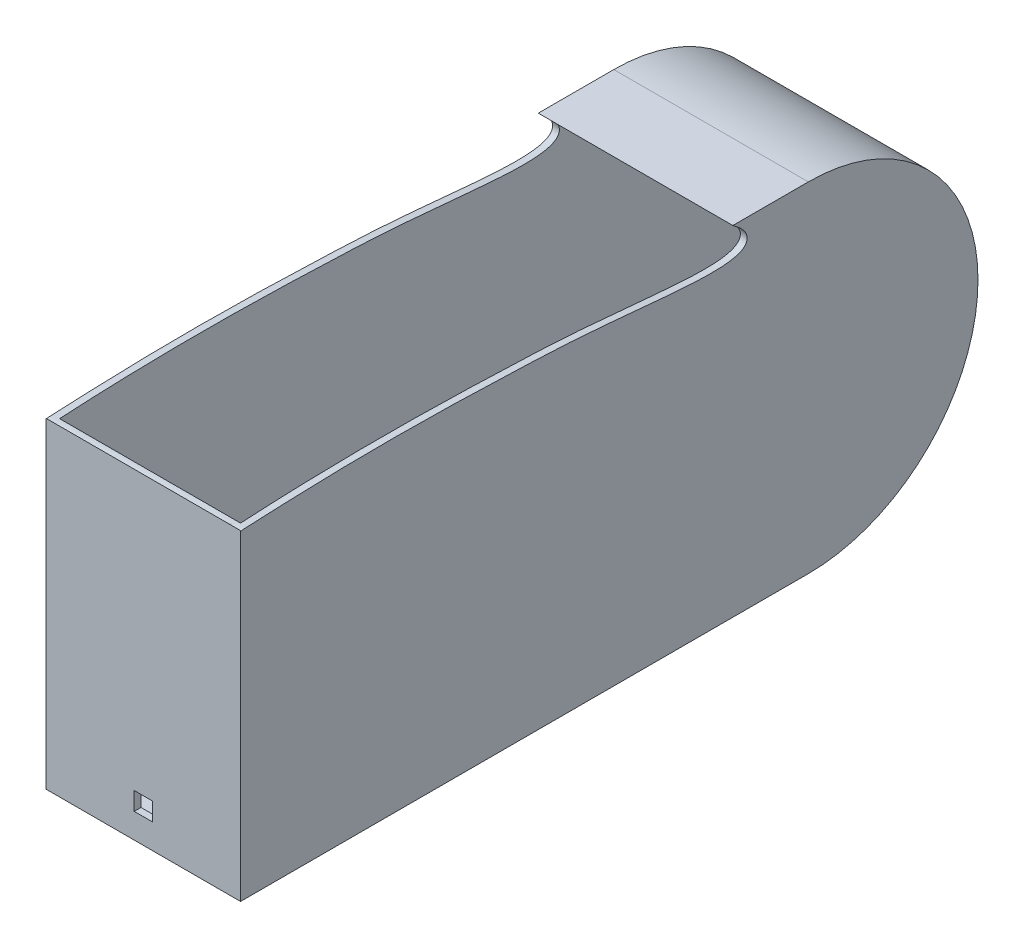
ISO-10303-21;
HEADER;
FILE_DESCRIPTION(('STEP AP214'),'2;1');
FILE_NAME('part.step','',(''),(''),'','','');
FILE_SCHEMA(('AUTOMOTIVE_DESIGN { 1 0 10303 214 1 1 1 1 }'));
ENDSEC;
DATA;
#1=APPLICATION_CONTEXT('core data for automotive mechanical design processes');
#2=APPLICATION_PROTOCOL_DEFINITION('international standard','automotive_design',2000,#1);
#3=PRODUCT_CONTEXT('',#1,'mechanical');
#4=PRODUCT('Part','Part','',(#3));
#5=PRODUCT_RELATED_PRODUCT_CATEGORY('part','',(#4));
#6=PRODUCT_DEFINITION_FORMATION('','',#4);
#7=PRODUCT_DEFINITION_CONTEXT('part definition',#1,'design');
#8=PRODUCT_DEFINITION('design','',#6,#7);
#9=PRODUCT_DEFINITION_SHAPE('','',#8);
#10=(LENGTH_UNIT() NAMED_UNIT(*) SI_UNIT(.MILLI.,.METRE.));
#11=(NAMED_UNIT(*) PLANE_ANGLE_UNIT() SI_UNIT($,.RADIAN.));
#12=(NAMED_UNIT(*) SI_UNIT($,.STERADIAN.) SOLID_ANGLE_UNIT());
#13=UNCERTAINTY_MEASURE_WITH_UNIT(LENGTH_MEASURE(1.E-05),#10,'distance_accuracy_value','');
#14=(GEOMETRIC_REPRESENTATION_CONTEXT(3) GLOBAL_UNCERTAINTY_ASSIGNED_CONTEXT((#13)) GLOBAL_UNIT_ASSIGNED_CONTEXT((#10,
#11,#12)) REPRESENTATION_CONTEXT('',''));
#15=CARTESIAN_POINT('',(0.,0.,0.));
#16=DIRECTION('',(0.,0.,1.));
#17=DIRECTION('',(1.,0.,0.));
#18=AXIS2_PLACEMENT_3D('',#15,#16,#17);
#19=CARTESIAN_POINT('',(-63.5,114.3,0.));
#20=DIRECTION('',(1.,0.,0.));
#21=DIRECTION('',(0.,0.,-1.));
#22=AXIS2_PLACEMENT_3D('',#19,#20,#21);
#23=CYLINDRICAL_SURFACE('',#22,119.0625);
#24=DIRECTION('',(1.,0.,0.));
#25=VECTOR('',#24,1.);
#26=CARTESIAN_POINT('',(-63.5,233.3625,0.));
#27=LINE('',#26,#25);
#28=CARTESIAN_POINT('',(-68.2625,233.3625,0.));
#29=VERTEX_POINT('',#28);
#30=CARTESIAN_POINT('',(68.2625,233.3625,0.));
#31=VERTEX_POINT('',#30);
#32=EDGE_CURVE('E159',#29,#31,#27,.T.);
#33=ORIENTED_EDGE('',*,*,#32,.T.);
#34=CARTESIAN_POINT('',(68.2625,114.3,0.));
#35=DIRECTION('',(1.,0.,0.));
#36=DIRECTION('',(0.,0.,-1.));
#37=AXIS2_PLACEMENT_3D('',#34,#35,#36);
#38=CIRCLE('',#37,119.0625);
#39=CARTESIAN_POINT('',(68.2625,-4.76249999999989,0.));
#40=VERTEX_POINT('',#39);
#41=EDGE_CURVE('E145',#40,#31,#38,.T.);
#42=ORIENTED_EDGE('',*,*,#41,.F.);
#43=DIRECTION('',(1.,0.,0.));
#44=VECTOR('',#43,1.);
#45=CARTESIAN_POINT('',(-63.5,-4.7625,0.));
#46=LINE('',#45,#44);
#47=CARTESIAN_POINT('',(-68.2625,-4.76249999999989,0.));
#48=VERTEX_POINT('',#47);
#49=EDGE_CURVE('E141',#48,#40,#46,.T.);
#50=ORIENTED_EDGE('',*,*,#49,.F.);
#51=CARTESIAN_POINT('',(-68.2625,114.3,0.));
#52=DIRECTION('',(1.,0.,0.));
#53=DIRECTION('',(0.,0.,-1.));
#54=AXIS2_PLACEMENT_3D('',#51,#52,#53);
#55=CIRCLE('',#54,119.0625);
#56=EDGE_CURVE('E143',#48,#29,#55,.T.);
#57=ORIENTED_EDGE('',*,*,#56,.T.);
#58=EDGE_LOOP('',(#33,#42,#50,#57));
#59=FACE_BOUND('',#58,.T.);
#60=ADVANCED_FACE('F38',(#59),#23,.T.);
#61=CARTESIAN_POINT('',(-63.5,-4.7625,0.));
#62=DIRECTION('',(0.,-1.,0.));
#63=DIRECTION('',(0.,0.,-1.));
#64=AXIS2_PLACEMENT_3D('',#61,#62,#63);
#65=PLANE('',#64);
#66=ORIENTED_EDGE('',*,*,#49,.T.);
#67=DIRECTION('',(0.,0.,-1.));
#68=VECTOR('',#67,1.);
#69=CARTESIAN_POINT('',(68.2625,-4.76249999999989,398.4625));
#70=LINE('',#69,#68);
#71=CARTESIAN_POINT('',(68.2625,-4.76249999999989,398.4625));
#72=VERTEX_POINT('',#71);
#73=EDGE_CURVE('E170',#72,#40,#70,.T.);
#74=ORIENTED_EDGE('',*,*,#73,.F.);
#75=DIRECTION('',(1.,0.,0.));
#76=VECTOR('',#75,1.);
#77=CARTESIAN_POINT('',(-63.5,-4.76250000000005,398.4625));
#78=LINE('',#77,#76);
#79=CARTESIAN_POINT('',(-68.2625,-4.76249999999989,398.4625));
#80=VERTEX_POINT('',#79);
#81=EDGE_CURVE('E164',#80,#72,#78,.T.);
#82=ORIENTED_EDGE('',*,*,#81,.F.);
#83=DIRECTION('',(0.,0.,-1.));
#84=VECTOR('',#83,1.);
#85=CARTESIAN_POINT('',(-68.2625,-4.76249999999989,398.4625));
#86=LINE('',#85,#84);
#87=EDGE_CURVE('E150',#80,#48,#86,.T.);
#88=ORIENTED_EDGE('',*,*,#87,.T.);
#89=EDGE_LOOP('',(#66,#74,#82,#88));
#90=FACE_BOUND('',#89,.T.);
#91=ADVANCED_FACE('F162',(#90),#65,.T.);
#92=CARTESIAN_POINT('',(-63.5,-4.76250000000005,398.4625));
#93=DIRECTION('',(0.,0.,1.));
#94=DIRECTION('',(1.,0.,0.));
#95=AXIS2_PLACEMENT_3D('',#92,#93,#94);
#96=PLANE('',#95);
#97=DIRECTION('',(-1.,0.,0.));
#98=VECTOR('',#97,1.);
#99=CARTESIAN_POINT('',(68.2635,220.6625,398.4625));
#100=LINE('',#99,#98);
#101=CARTESIAN_POINT('',(68.2625,220.6625,398.4625));
#102=VERTEX_POINT('',#101);
#103=CARTESIAN_POINT('',(-68.2625,220.6625,398.4625));
#104=VERTEX_POINT('',#103);
#105=EDGE_CURVE('E165',#102,#104,#100,.T.);
#106=ORIENTED_EDGE('',*,*,#105,.T.);
#107=DIRECTION('',(0.,-1.,0.));
#108=VECTOR('',#107,1.);
#109=CARTESIAN_POINT('',(-68.2625,233.3625,398.4625));
#110=LINE('',#109,#108);
#111=EDGE_CURVE('E167',#104,#80,#110,.T.);
#112=ORIENTED_EDGE('',*,*,#111,.T.);
#113=ORIENTED_EDGE('',*,*,#81,.T.);
#114=DIRECTION('',(0.,-1.,0.));
#115=VECTOR('',#114,1.);
#116=CARTESIAN_POINT('',(68.2625,233.3625,398.4625));
#117=LINE('',#116,#115);
#118=EDGE_CURVE('E194',#102,#72,#117,.T.);
#119=ORIENTED_EDGE('',*,*,#118,.F.);
#120=EDGE_LOOP('',(#106,#112,#113,#119));
#121=FACE_BOUND('',#120,.T.);
#122=DIRECTION('',(1.,0.,0.));
#123=VECTOR('',#122,1.);
#124=CARTESIAN_POINT('',(-6.35,12.7,398.4625));
#125=LINE('',#124,#123);
#126=CARTESIAN_POINT('',(-6.35,12.7,398.4625));
#127=VERTEX_POINT('',#126);
#128=CARTESIAN_POINT('',(6.35,12.7,398.4625));
#129=VERTEX_POINT('',#128);
#130=EDGE_CURVE('E241',#127,#129,#125,.T.);
#131=ORIENTED_EDGE('',*,*,#130,.F.);
#132=DIRECTION('',(0.,-1.,0.));
#133=VECTOR('',#132,1.);
#134=CARTESIAN_POINT('',(-6.35,25.4,398.4625));
#135=LINE('',#134,#133);
#136=CARTESIAN_POINT('',(-6.35,25.4,398.4625));
#137=VERTEX_POINT('',#136);
#138=EDGE_CURVE('E209',#137,#127,#135,.T.);
#139=ORIENTED_EDGE('',*,*,#138,.F.);
#140=DIRECTION('',(-1.,0.,0.));
#141=VECTOR('',#140,1.);
#142=CARTESIAN_POINT('',(-6.35,25.4,398.4625));
#143=LINE('',#142,#141);
#144=CARTESIAN_POINT('',(6.35,25.4,398.4625));
#145=VERTEX_POINT('',#144);
#146=EDGE_CURVE('E249',#145,#137,#143,.T.);
#147=ORIENTED_EDGE('',*,*,#146,.F.);
#148=DIRECTION('',(0.,1.,0.));
#149=VECTOR('',#148,1.);
#150=CARTESIAN_POINT('',(6.35,25.4,398.4625));
#151=LINE('',#150,#149);
#152=EDGE_CURVE('E245',#129,#145,#151,.T.);
#153=ORIENTED_EDGE('',*,*,#152,.F.);
#154=EDGE_LOOP('',(#131,#139,#147,#153));
#155=FACE_BOUND('',#154,.T.);
#156=ADVANCED_FACE('F273',(#121,#155),#96,.T.);
#157=CARTESIAN_POINT('',(-63.5,233.3625,398.4625));
#158=DIRECTION('',(0.,1.,0.));
#159=DIRECTION('',(0.,0.,1.));
#160=AXIS2_PLACEMENT_3D('',#157,#158,#159);
#161=PLANE('',#160);
#162=DIRECTION('',(-1.,0.,0.));
#163=VECTOR('',#162,1.);
#164=CARTESIAN_POINT('',(68.2635,233.3625,52.9941406970026));
#165=LINE('',#164,#163);
#166=CARTESIAN_POINT('',(-68.2625,233.3625,52.9941406970063));
#167=VERTEX_POINT('',#166);
#168=CARTESIAN_POINT('',(68.2625,233.3625,52.9941406970064));
#169=VERTEX_POINT('',#168);
#170=EDGE_CURVE('E82',#167,#169,#165,.F.);
#171=ORIENTED_EDGE('',*,*,#170,.T.);
#172=DIRECTION('',(0.,0.,1.));
#173=VECTOR('',#172,1.);
#174=CARTESIAN_POINT('',(68.2625,233.3625,398.4625));
#175=LINE('',#174,#173);
#176=EDGE_CURVE('E184',#31,#169,#175,.T.);
#177=ORIENTED_EDGE('',*,*,#176,.F.);
#178=ORIENTED_EDGE('',*,*,#32,.F.);
#179=DIRECTION('',(0.,0.,1.));
#180=VECTOR('',#179,1.);
#181=CARTESIAN_POINT('',(-68.2625,233.3625,398.4625));
#182=LINE('',#181,#180);
#183=EDGE_CURVE('E158',#29,#167,#182,.T.);
#184=ORIENTED_EDGE('',*,*,#183,.T.);
#185=EDGE_LOOP('',(#171,#177,#178,#184));
#186=FACE_BOUND('',#185,.T.);
#187=ADVANCED_FACE('F318',(#186),#161,.T.);
#188=CARTESIAN_POINT('',(-63.5,114.3,0.));
#189=DIRECTION('',(1.,0.,0.));
#190=DIRECTION('',(0.,0.,-1.));
#191=AXIS2_PLACEMENT_3D('',#188,#189,#190);
#192=CYLINDRICAL_SURFACE('',#191,114.3);
#193=DIRECTION('',(1.,0.,0.));
#194=VECTOR('',#193,1.);
#195=CARTESIAN_POINT('',(-63.5,0.,0.));
#196=LINE('',#195,#194);
#197=CARTESIAN_POINT('',(-63.5,0.,0.));
#198=VERTEX_POINT('',#197);
#199=CARTESIAN_POINT('',(63.5,0.,0.));
#200=VERTEX_POINT('',#199);
#201=EDGE_CURVE('E198',#198,#200,#196,.T.);
#202=ORIENTED_EDGE('',*,*,#201,.T.);
#203=CARTESIAN_POINT('',(63.5,114.3,0.));
#204=DIRECTION('',(1.,0.,0.));
#205=DIRECTION('',(0.,0.,-1.));
#206=AXIS2_PLACEMENT_3D('',#203,#204,#205);
#207=CIRCLE('',#206,114.3);
#208=CARTESIAN_POINT('',(63.5,228.6,0.));
#209=VERTEX_POINT('',#208);
#210=EDGE_CURVE('E236',#200,#209,#207,.T.);
#211=ORIENTED_EDGE('',*,*,#210,.T.);
#212=DIRECTION('',(1.,0.,0.));
#213=VECTOR('',#212,1.);
#214=CARTESIAN_POINT('',(-63.5,228.6,0.));
#215=LINE('',#214,#213);
#216=CARTESIAN_POINT('',(-63.5,228.6,0.));
#217=VERTEX_POINT('',#216);
#218=EDGE_CURVE('E191',#217,#209,#215,.T.);
#219=ORIENTED_EDGE('',*,*,#218,.F.);
#220=CARTESIAN_POINT('',(-63.5,114.3,0.));
#221=DIRECTION('',(1.,0.,0.));
#222=DIRECTION('',(0.,0.,-1.));
#223=AXIS2_PLACEMENT_3D('',#220,#221,#222);
#224=CIRCLE('',#223,114.3);
#225=EDGE_CURVE('E221',#198,#217,#224,.T.);
#226=ORIENTED_EDGE('',*,*,#225,.F.);
#227=EDGE_LOOP('',(#202,#211,#219,#226));
#228=FACE_BOUND('',#227,.T.);
#229=ADVANCED_FACE('F283',(#228),#192,.F.);
#230=CARTESIAN_POINT('',(-63.5,0.,0.));
#231=DIRECTION('',(0.,-1.,0.));
#232=DIRECTION('',(0.,0.,-1.));
#233=AXIS2_PLACEMENT_3D('',#230,#231,#232);
#234=PLANE('',#233);
#235=DIRECTION('',(1.,0.,0.));
#236=VECTOR('',#235,1.);
#237=CARTESIAN_POINT('',(-63.5,0.,393.7));
#238=LINE('',#237,#236);
#239=CARTESIAN_POINT('',(-63.5,0.,393.7));
#240=VERTEX_POINT('',#239);
#241=CARTESIAN_POINT('',(63.5,0.,393.7));
#242=VERTEX_POINT('',#241);
#243=EDGE_CURVE('E235',#240,#242,#238,.T.);
#244=ORIENTED_EDGE('',*,*,#243,.T.);
#245=DIRECTION('',(0.,0.,-1.));
#246=VECTOR('',#245,1.);
#247=CARTESIAN_POINT('',(63.5,0.,0.));
#248=LINE('',#247,#246);
#249=EDGE_CURVE('E188',#242,#200,#248,.T.);
#250=ORIENTED_EDGE('',*,*,#249,.T.);
#251=ORIENTED_EDGE('',*,*,#201,.F.);
#252=DIRECTION('',(0.,0.,-1.));
#253=VECTOR('',#252,1.);
#254=CARTESIAN_POINT('',(-63.5,0.,0.));
#255=LINE('',#254,#253);
#256=EDGE_CURVE('E179',#240,#198,#255,.T.);
#257=ORIENTED_EDGE('',*,*,#256,.F.);
#258=EDGE_LOOP('',(#244,#250,#251,#257));
#259=FACE_BOUND('',#258,.T.);
#260=ADVANCED_FACE('F287',(#259),#234,.F.);
#261=CARTESIAN_POINT('',(-63.5,0.,393.7));
#262=DIRECTION('',(0.,0.,1.));
#263=DIRECTION('',(1.,0.,0.));
#264=AXIS2_PLACEMENT_3D('',#261,#262,#263);
#265=PLANE('',#264);
#266=DIRECTION('',(0.,1.,0.));
#267=VECTOR('',#266,1.);
#268=CARTESIAN_POINT('',(-6.35,25.4,393.7));
#269=LINE('',#268,#267);
#270=CARTESIAN_POINT('',(-6.35,12.7,393.7));
#271=VERTEX_POINT('',#270);
#272=CARTESIAN_POINT('',(-6.35,25.4,393.7));
#273=VERTEX_POINT('',#272);
#274=EDGE_CURVE('E254',#271,#273,#269,.T.);
#275=ORIENTED_EDGE('',*,*,#274,.F.);
#276=DIRECTION('',(-1.,0.,0.));
#277=VECTOR('',#276,1.);
#278=CARTESIAN_POINT('',(-6.35,12.7,393.7));
#279=LINE('',#278,#277);
#280=CARTESIAN_POINT('',(6.35,12.7,393.7));
#281=VERTEX_POINT('',#280);
#282=EDGE_CURVE('E242',#281,#271,#279,.T.);
#283=ORIENTED_EDGE('',*,*,#282,.F.);
#284=DIRECTION('',(0.,-1.,0.));
#285=VECTOR('',#284,1.);
#286=CARTESIAN_POINT('',(6.35,25.4,393.7));
#287=LINE('',#286,#285);
#288=CARTESIAN_POINT('',(6.35,25.4,393.7));
#289=VERTEX_POINT('',#288);
#290=EDGE_CURVE('E246',#289,#281,#287,.T.);
#291=ORIENTED_EDGE('',*,*,#290,.F.);
#292=DIRECTION('',(1.,0.,0.));
#293=VECTOR('',#292,1.);
#294=CARTESIAN_POINT('',(-6.35,25.4,393.7));
#295=LINE('',#294,#293);
#296=EDGE_CURVE('E250',#273,#289,#295,.T.);
#297=ORIENTED_EDGE('',*,*,#296,.F.);
#298=EDGE_LOOP('',(#275,#283,#291,#297));
#299=FACE_BOUND('',#298,.T.);
#300=DIRECTION('',(0.,-1.,0.));
#301=VECTOR('',#300,1.);
#302=CARTESIAN_POINT('',(-63.5,0.,393.7));
#303=LINE('',#302,#301);
#304=CARTESIAN_POINT('',(-63.5,220.431417677347,393.7));
#305=VERTEX_POINT('',#304);
#306=EDGE_CURVE('E177',#305,#240,#303,.T.);
#307=ORIENTED_EDGE('',*,*,#306,.F.);
#308=DIRECTION('',(-1.,0.,0.));
#309=VECTOR('',#308,1.);
#310=CARTESIAN_POINT('',(68.2635,220.431417677364,393.7));
#311=LINE('',#310,#309);
#312=CARTESIAN_POINT('',(63.5,220.431417677347,393.700000003167));
#313=VERTEX_POINT('',#312);
#314=EDGE_CURVE('E174',#313,#305,#311,.T.);
#315=ORIENTED_EDGE('',*,*,#314,.F.);
#316=DIRECTION('',(0.,-1.,0.));
#317=VECTOR('',#316,1.);
#318=CARTESIAN_POINT('',(63.5,0.,393.7));
#319=LINE('',#318,#317);
#320=EDGE_CURVE('E185',#313,#242,#319,.T.);
#321=ORIENTED_EDGE('',*,*,#320,.T.);
#322=ORIENTED_EDGE('',*,*,#243,.F.);
#323=EDGE_LOOP('',(#307,#315,#321,#322));
#324=FACE_BOUND('',#323,.T.);
#325=ADVANCED_FACE('F40',(#299,#324),#265,.F.);
#326=CARTESIAN_POINT('',(-63.5,228.6,393.7));
#327=DIRECTION('',(0.,1.,0.));
#328=DIRECTION('',(0.,0.,1.));
#329=AXIS2_PLACEMENT_3D('',#326,#327,#328);
#330=PLANE('',#329);
#331=DIRECTION('',(0.,0.,1.));
#332=VECTOR('',#331,1.);
#333=CARTESIAN_POINT('',(63.5,228.6,393.7));
#334=LINE('',#333,#332);
#335=CARTESIAN_POINT('',(63.5,228.600000000172,47.2494261996637));
#336=VERTEX_POINT('',#335);
#337=EDGE_CURVE('E187',#209,#336,#334,.T.);
#338=ORIENTED_EDGE('',*,*,#337,.T.);
#339=DIRECTION('',(-1.,0.,0.));
#340=VECTOR('',#339,1.);
#341=CARTESIAN_POINT('',(68.2635,228.6,47.2494261994933));
#342=LINE('',#341,#340);
#343=CARTESIAN_POINT('',(-63.5,228.6,47.2494261996637));
#344=VERTEX_POINT('',#343);
#345=EDGE_CURVE('E50',#344,#336,#342,.F.);
#346=ORIENTED_EDGE('',*,*,#345,.F.);
#347=DIRECTION('',(0.,0.,1.));
#348=VECTOR('',#347,1.);
#349=CARTESIAN_POINT('',(-63.5,228.6,393.7));
#350=LINE('',#349,#348);
#351=EDGE_CURVE('E181',#217,#344,#350,.T.);
#352=ORIENTED_EDGE('',*,*,#351,.F.);
#353=ORIENTED_EDGE('',*,*,#218,.T.);
#354=EDGE_LOOP('',(#338,#346,#352,#353));
#355=FACE_BOUND('',#354,.T.);
#356=ADVANCED_FACE('F295',(#355),#330,.F.);
#357=CARTESIAN_POINT('',(-6.35,12.7,-119.0635));
#358=DIRECTION('',(0.,-1.,0.));
#359=DIRECTION('',(0.,0.,-1.));
#360=AXIS2_PLACEMENT_3D('',#357,#358,#359);
#361=PLANE('',#360);
#362=ORIENTED_EDGE('',*,*,#282,.T.);
#363=DIRECTION('',(0.,0.,1.));
#364=VECTOR('',#363,1.);
#365=CARTESIAN_POINT('',(-6.35,12.7,-119.0635));
#366=LINE('',#365,#364);
#367=EDGE_CURVE('E239',#271,#127,#366,.T.);
#368=ORIENTED_EDGE('',*,*,#367,.T.);
#369=ORIENTED_EDGE('',*,*,#130,.T.);
#370=DIRECTION('',(0.,0.,1.));
#371=VECTOR('',#370,1.);
#372=CARTESIAN_POINT('',(6.35,12.7,-119.0635));
#373=LINE('',#372,#371);
#374=EDGE_CURVE('E243',#281,#129,#373,.T.);
#375=ORIENTED_EDGE('',*,*,#374,.F.);
#376=EDGE_LOOP('',(#362,#368,#369,#375));
#377=FACE_BOUND('',#376,.T.);
#378=ADVANCED_FACE('F307',(#377),#361,.F.);
#379=CARTESIAN_POINT('',(6.35,25.4,-119.0635));
#380=DIRECTION('',(1.,0.,0.));
#381=DIRECTION('',(0.,1.,0.));
#382=AXIS2_PLACEMENT_3D('',#379,#380,#381);
#383=PLANE('',#382);
#384=ORIENTED_EDGE('',*,*,#290,.T.);
#385=ORIENTED_EDGE('',*,*,#374,.T.);
#386=ORIENTED_EDGE('',*,*,#152,.T.);
#387=DIRECTION('',(0.,0.,1.));
#388=VECTOR('',#387,1.);
#389=CARTESIAN_POINT('',(6.35,25.4,-119.0635));
#390=LINE('',#389,#388);
#391=EDGE_CURVE('E247',#289,#145,#390,.T.);
#392=ORIENTED_EDGE('',*,*,#391,.F.);
#393=EDGE_LOOP('',(#384,#385,#386,#392));
#394=FACE_BOUND('',#393,.T.);
#395=ADVANCED_FACE('F322',(#394),#383,.F.);
#396=CARTESIAN_POINT('',(-6.35,25.4,-119.0635));
#397=DIRECTION('',(0.,1.,0.));
#398=DIRECTION('',(0.,0.,1.));
#399=AXIS2_PLACEMENT_3D('',#396,#397,#398);
#400=PLANE('',#399);
#401=ORIENTED_EDGE('',*,*,#296,.T.);
#402=ORIENTED_EDGE('',*,*,#391,.T.);
#403=ORIENTED_EDGE('',*,*,#146,.T.);
#404=DIRECTION('',(0.,0.,1.));
#405=VECTOR('',#404,1.);
#406=CARTESIAN_POINT('',(-6.35,25.4,-119.0635));
#407=LINE('',#406,#405);
#408=EDGE_CURVE('E251',#273,#137,#407,.T.);
#409=ORIENTED_EDGE('',*,*,#408,.F.);
#410=EDGE_LOOP('',(#401,#402,#403,#409));
#411=FACE_BOUND('',#410,.T.);
#412=ADVANCED_FACE('F326',(#411),#400,.F.);
#413=CARTESIAN_POINT('',(-6.35,25.4,-119.0635));
#414=DIRECTION('',(-1.,0.,0.));
#415=DIRECTION('',(0.,-1.,0.));
#416=AXIS2_PLACEMENT_3D('',#413,#414,#415);
#417=PLANE('',#416);
#418=ORIENTED_EDGE('',*,*,#274,.T.);
#419=ORIENTED_EDGE('',*,*,#408,.T.);
#420=ORIENTED_EDGE('',*,*,#138,.T.);
#421=ORIENTED_EDGE('',*,*,#367,.F.);
#422=EDGE_LOOP('',(#418,#419,#420,#421));
#423=FACE_BOUND('',#422,.T.);
#424=ADVANCED_FACE('F330',(#423),#417,.F.);
#425=CARTESIAN_POINT('',(63.5,114.3,0.));
#426=DIRECTION('',(1.,0.,0.));
#427=DIRECTION('',(0.,0.,-1.));
#428=AXIS2_PLACEMENT_3D('',#425,#426,#427);
#429=PLANE('',#428);
#430=ORIENTED_EDGE('',*,*,#320,.F.);
#431=CARTESIAN_POINT('',(63.5,221.103452286152,398.549393222915));
#432=CARTESIAN_POINT('',(63.5,221.211009465947,398.232700594571));
#433=CARTESIAN_POINT('',(63.5,221.639549780142,396.970901440742));
#434=CARTESIAN_POINT('',(63.5,222.600485882355,394.146421090202));
#435=CARTESIAN_POINT('',(63.5,224.150302438679,389.462953516682));
#436=CARTESIAN_POINT('',(63.5,226.259749177724,382.969998463607));
#437=CARTESIAN_POINT('',(63.5,228.841368447249,374.723245355379));
#438=CARTESIAN_POINT('',(63.5,231.81387248124,364.800004809874));
#439=CARTESIAN_POINT('',(63.5,235.083165456711,353.29797869617));
#440=CARTESIAN_POINT('',(63.5,238.545255757918,340.328032508214));
#441=CARTESIAN_POINT('',(63.5,242.094575025628,326.021148985206));
#442=CARTESIAN_POINT('',(63.5,245.617549826205,310.521429797442));
#443=CARTESIAN_POINT('',(63.5,249.024771645133,293.99492793284));
#444=CARTESIAN_POINT('',(63.5,252.204320359588,276.614504443241));
#445=CARTESIAN_POINT('',(63.5,255.061254060712,258.567862768213));
#446=CARTESIAN_POINT('',(63.5,257.520201331038,240.053343741062));
#447=CARTESIAN_POINT('',(63.5,259.500514547056,221.279209388613));
#448=CARTESIAN_POINT('',(63.5,260.937616248262,202.447059387589));
#449=CARTESIAN_POINT('',(63.5,261.853164617752,183.641819280323));
#450=CARTESIAN_POINT('',(63.5,261.889242871964,165.066079575411));
#451=CARTESIAN_POINT('',(63.5,260.902418125429,146.980070346122));
#452=CARTESIAN_POINT('',(63.5,258.9850339095,129.758757052741));
#453=CARTESIAN_POINT('',(63.5,256.246806811277,113.629585220945));
#454=CARTESIAN_POINT('',(63.5,252.805079968523,98.8044568058425));
#455=CARTESIAN_POINT('',(63.5,248.825528286306,85.4686561606705));
#456=CARTESIAN_POINT('',(63.5,244.484590441484,73.7774953433273));
#457=CARTESIAN_POINT('',(63.5,239.956374948211,63.8562172520555));
#458=CARTESIAN_POINT('',(63.5,235.414103693613,55.7982016235295));
#459=CARTESIAN_POINT('',(63.5,231.01719821287,49.6386087890458));
#460=CARTESIAN_POINT('',(63.5,226.860803831245,45.4101405287787));
#461=CARTESIAN_POINT('',(63.5,222.931348779444,42.9828663673022));
#462=CARTESIAN_POINT('',(63.5,218.986296857464,42.778551080553));
#463=CARTESIAN_POINT('',(63.5,215.836723638551,45.1303745015469));
#464=CARTESIAN_POINT('',(63.5,213.876038864295,49.2376949401899));
#465=CARTESIAN_POINT('',(63.5,212.601675942051,54.8784894371254));
#466=CARTESIAN_POINT('',(63.5,211.952589942483,62.1414319366596));
#467=CARTESIAN_POINT('',(63.5,211.854882503057,70.9544974326083));
#468=CARTESIAN_POINT('',(63.5,212.250908039219,81.233579012899));
#469=CARTESIAN_POINT('',(63.5,213.053608959908,92.8633516606358));
#470=CARTESIAN_POINT('',(63.5,214.173533720422,105.724740235377));
#471=CARTESIAN_POINT('',(63.5,215.488554616551,119.693166749208));
#472=CARTESIAN_POINT('',(63.5,216.890924890213,134.64317648004));
#473=CARTESIAN_POINT('',(63.5,218.264163949801,150.44570999627));
#474=CARTESIAN_POINT('',(63.5,219.486485378968,166.970044113907));
#475=CARTESIAN_POINT('',(63.5,220.428545699325,184.211284991632));
#476=CARTESIAN_POINT('',(63.5,221.118607839099,202.015771526671));
#477=CARTESIAN_POINT('',(63.5,221.829251020905,220.195805294187));
#478=CARTESIAN_POINT('',(63.5,222.413221362861,238.435682057207));
#479=CARTESIAN_POINT('',(63.5,222.857510837363,256.531925378719));
#480=CARTESIAN_POINT('',(63.5,223.140033413405,274.291608724487));
#481=CARTESIAN_POINT('',(63.5,223.252027693137,291.519175726337));
#482=CARTESIAN_POINT('',(63.5,223.203320199009,308.022545068698));
#483=CARTESIAN_POINT('',(63.5,223.020606611835,323.615565220504));
#484=CARTESIAN_POINT('',(63.5,222.71075189044,338.118364345008));
#485=CARTESIAN_POINT('',(63.5,222.338100855146,351.360747498457));
#486=CARTESIAN_POINT('',(63.5,221.908988988218,363.191371257319));
#487=CARTESIAN_POINT('',(63.5,221.495841486537,373.444754132704));
#488=CARTESIAN_POINT('',(63.5,221.047668799869,382.066215664096));
#489=CARTESIAN_POINT('',(63.5,220.841691742326,388.75364095758));
#490=CARTESIAN_POINT('',(63.5,220.266487962213,393.905599592566));
#491=CARTESIAN_POINT('',(63.5,220.648579963455,396.455855293674));
#492=CARTESIAN_POINT('',(63.5,219.934638372019,398.42299084249));
#493=CARTESIAN_POINT('',(63.5,220.490245124887,398.453149809345));
#494=CARTESIAN_POINT('',(63.5,220.6625,398.4625));
#495=B_SPLINE_CURVE_WITH_KNOTS('',3,(#431,#432,#433,#434,#435,#436,#437,#438,#439,#440,#441,
#442,#443,#444,#445,#446,#447,#448,#449,#450,#451,#452,#453,#454,#455,#456,#457,#458,#459,#460,
#461,#462,#463,#464,#465,#466,#467,#468,#469,#470,#471,#472,#473,#474,#475,#476,#477,#478,#479,
#480,#481,#482,#483,#484,#485,#486,#487,#488,#489,#490,#491,#492,#493,#494),.UNSPECIFIED.,.F.,
.F.,(4,1,1,1,1,1,1,1,1,1,1,1,1,1,1,1,1,1,1,1,1,1,1,1,1,1,1,1,1,1,1,1,1,1,1,1,1,1,1,1,1,1,1,1,1,
1,1,1,1,1,1,1,1,1,1,1,1,1,1,1,1,4),(0.,0.0013715766250261,0.00546477584250823,
0.0122348018502247,0.0216019692657692,0.0334613445682541,0.0476712497544171,0.0640813180473265,
0.082496261138008,0.102719148689264,0.124527079157664,0.14767564836169,0.171912572572513,
0.196978379588112,0.222596912267761,0.248496766675201,0.274385100810321,0.300041178316028,
0.325689987882079,0.350525087532111,0.374279703233646,0.39671125377608,0.41757673414408,
0.436654005915541,0.45374438973928,0.468679993939526,0.481329415272233,0.491630702034347,
0.499615788540128,0.50554628117804,0.510184984462959,0.514824193684277,0.520701508332397,
0.528516039729706,0.538465751713385,0.55054260931231,0.564643256443601,0.580638139182816,
0.598344876375769,0.617584458372554,0.638174400803704,0.659922089978603,0.682632113153432,
0.706120665440723,0.730727382957721,0.755700243562022,0.780731768779878,0.805564462972336,
0.829932395841959,0.853570292180875,0.876213105152017,0.897609986535304,0.917519393525195,
0.93569834721614,0.951942678095032,0.966047158851578,0.977839939974046,0.987174001699795,
0.993931500880097,0.998018399437236,0.999385643972647,1.),.UNSPECIFIED.);
#496=EDGE_CURVE('E11',#336,#313,#495,.T.);
#497=ORIENTED_EDGE('',*,*,#496,.F.);
#498=ORIENTED_EDGE('',*,*,#337,.F.);
#499=ORIENTED_EDGE('',*,*,#210,.F.);
#500=ORIENTED_EDGE('',*,*,#249,.F.);
#501=EDGE_LOOP('',(#430,#497,#498,#499,#500));
#502=FACE_BOUND('',#501,.T.);
#503=ADVANCED_FACE('F291',(#502),#429,.F.);
#504=CARTESIAN_POINT('',(68.2625,114.3,0.));
#505=DIRECTION('',(1.,0.,0.));
#506=DIRECTION('',(0.,0.,-1.));
#507=AXIS2_PLACEMENT_3D('',#504,#505,#506);
#508=PLANE('',#507);
#509=CARTESIAN_POINT('',(68.2625,221.103452286152,398.549393222915));
#510=CARTESIAN_POINT('',(68.2625,221.211009465947,398.232700594571));
#511=CARTESIAN_POINT('',(68.2625,221.639549780142,396.970901440742));
#512=CARTESIAN_POINT('',(68.2625,222.600485882355,394.146421090202));
#513=CARTESIAN_POINT('',(68.2625,224.150302438679,389.462953516682));
#514=CARTESIAN_POINT('',(68.2625,226.259749177724,382.969998463607));
#515=CARTESIAN_POINT('',(68.2625,228.841368447249,374.723245355379));
#516=CARTESIAN_POINT('',(68.2625,231.81387248124,364.800004809874));
#517=CARTESIAN_POINT('',(68.2625,235.083165456711,353.29797869617));
#518=CARTESIAN_POINT('',(68.2625,238.545255757918,340.328032508214));
#519=CARTESIAN_POINT('',(68.2625,242.094575025628,326.021148985206));
#520=CARTESIAN_POINT('',(68.2625,245.617549826205,310.521429797442));
#521=CARTESIAN_POINT('',(68.2625,249.024771645133,293.99492793284));
#522=CARTESIAN_POINT('',(68.2625,252.204320359588,276.614504443241));
#523=CARTESIAN_POINT('',(68.2625,255.061254060712,258.567862768213));
#524=CARTESIAN_POINT('',(68.2625,257.520201331038,240.053343741062));
#525=CARTESIAN_POINT('',(68.2625,259.500514547056,221.279209388613));
#526=CARTESIAN_POINT('',(68.2625,260.937616248262,202.447059387589));
#527=CARTESIAN_POINT('',(68.2625,261.853164617752,183.641819280323));
#528=CARTESIAN_POINT('',(68.2625,261.889242871964,165.066079575411));
#529=CARTESIAN_POINT('',(68.2625,260.902418125429,146.980070346122));
#530=CARTESIAN_POINT('',(68.2625,258.9850339095,129.758757052741));
#531=CARTESIAN_POINT('',(68.2625,256.246806811277,113.629585220945));
#532=CARTESIAN_POINT('',(68.2625,252.805079968523,98.8044568058425));
#533=CARTESIAN_POINT('',(68.2625,248.825528286306,85.4686561606705));
#534=CARTESIAN_POINT('',(68.2625,244.484590441484,73.7774953433273));
#535=CARTESIAN_POINT('',(68.2625,239.956374948211,63.8562172520555));
#536=CARTESIAN_POINT('',(68.2625,235.414103693613,55.7982016235295));
#537=CARTESIAN_POINT('',(68.2625,231.01719821287,49.6386087890458));
#538=CARTESIAN_POINT('',(68.2625,226.860803831245,45.4101405287787));
#539=CARTESIAN_POINT('',(68.2625,222.931348779444,42.9828663673022));
#540=CARTESIAN_POINT('',(68.2625,218.986296857464,42.778551080553));
#541=CARTESIAN_POINT('',(68.2625,215.836723638551,45.1303745015469));
#542=CARTESIAN_POINT('',(68.2625,213.876038864295,49.2376949401899));
#543=CARTESIAN_POINT('',(68.2625,212.601675942051,54.8784894371254));
#544=CARTESIAN_POINT('',(68.2625,211.952589942483,62.1414319366596));
#545=CARTESIAN_POINT('',(68.2625,211.854882503057,70.9544974326083));
#546=CARTESIAN_POINT('',(68.2625,212.250908039219,81.233579012899));
#547=CARTESIAN_POINT('',(68.2625,213.053608959908,92.8633516606358));
#548=CARTESIAN_POINT('',(68.2625,214.173533720422,105.724740235377));
#549=CARTESIAN_POINT('',(68.2625,215.488554616551,119.693166749208));
#550=CARTESIAN_POINT('',(68.2625,216.890924890213,134.64317648004));
#551=CARTESIAN_POINT('',(68.2625,218.264163949801,150.44570999627));
#552=CARTESIAN_POINT('',(68.2625,219.486485378968,166.970044113907));
#553=CARTESIAN_POINT('',(68.2625,220.428545699325,184.211284991632));
#554=CARTESIAN_POINT('',(68.2625,221.118607839099,202.015771526671));
#555=CARTESIAN_POINT('',(68.2625,221.829251020905,220.195805294187));
#556=CARTESIAN_POINT('',(68.2625,222.413221362861,238.435682057207));
#557=CARTESIAN_POINT('',(68.2625,222.857510837363,256.531925378719));
#558=CARTESIAN_POINT('',(68.2625,223.140033413405,274.291608724487));
#559=CARTESIAN_POINT('',(68.2625,223.252027693137,291.519175726337));
#560=CARTESIAN_POINT('',(68.2625,223.203320199009,308.022545068698));
#561=CARTESIAN_POINT('',(68.2625,223.020606611835,323.615565220504));
#562=CARTESIAN_POINT('',(68.2625,222.71075189044,338.118364345008));
#563=CARTESIAN_POINT('',(68.2625,222.338100855146,351.360747498457));
#564=CARTESIAN_POINT('',(68.2625,221.908988988218,363.191371257319));
#565=CARTESIAN_POINT('',(68.2625,221.495841486537,373.444754132704));
#566=CARTESIAN_POINT('',(68.2625,221.047668799869,382.066215664096));
#567=CARTESIAN_POINT('',(68.2625,220.841691742326,388.75364095758));
#568=CARTESIAN_POINT('',(68.2625,220.266487962213,393.905599592566));
#569=CARTESIAN_POINT('',(68.2625,220.648579963455,396.455855293674));
#570=CARTESIAN_POINT('',(68.2625,219.934638372019,398.42299084249));
#571=CARTESIAN_POINT('',(68.2625,220.490245124887,398.453149809345));
#572=CARTESIAN_POINT('',(68.2625,220.6625,398.4625));
#573=B_SPLINE_CURVE_WITH_KNOTS('',3,(#509,#510,#511,#512,#513,#514,#515,#516,#517,#518,#519,
#520,#521,#522,#523,#524,#525,#526,#527,#528,#529,#530,#531,#532,#533,#534,#535,#536,#537,#538,
#539,#540,#541,#542,#543,#544,#545,#546,#547,#548,#549,#550,#551,#552,#553,#554,#555,#556,#557,
#558,#559,#560,#561,#562,#563,#564,#565,#566,#567,#568,#569,#570,#571,#572),.UNSPECIFIED.,.F.,
.F.,(4,1,1,1,1,1,1,1,1,1,1,1,1,1,1,1,1,1,1,1,1,1,1,1,1,1,1,1,1,1,1,1,1,1,1,1,1,1,1,1,1,1,1,1,1,
1,1,1,1,1,1,1,1,1,1,1,1,1,1,1,1,4),(0.,0.0013715766250261,0.00546477584250823,
0.0122348018502247,0.0216019692657692,0.0334613445682541,0.0476712497544171,0.0640813180473265,
0.082496261138008,0.102719148689264,0.124527079157664,0.14767564836169,0.171912572572513,
0.196978379588112,0.222596912267761,0.248496766675201,0.274385100810321,0.300041178316028,
0.325689987882079,0.350525087532111,0.374279703233646,0.39671125377608,0.41757673414408,
0.436654005915541,0.45374438973928,0.468679993939526,0.481329415272233,0.491630702034347,
0.499615788540128,0.50554628117804,0.510184984462959,0.514824193684277,0.520701508332397,
0.528516039729706,0.538465751713385,0.55054260931231,0.564643256443601,0.580638139182816,
0.598344876375769,0.617584458372554,0.638174400803704,0.659922089978603,0.682632113153432,
0.706120665440723,0.730727382957721,0.755700243562022,0.780731768779878,0.805564462972336,
0.829932395841959,0.853570292180875,0.876213105152017,0.897609986535304,0.917519393525195,
0.93569834721614,0.951942678095032,0.966047158851578,0.977839939974046,0.987174001699795,
0.993931500880097,0.998018399437236,0.999385643972647,1.),.UNSPECIFIED.);
#574=EDGE_CURVE('E196',#169,#102,#573,.T.);
#575=ORIENTED_EDGE('',*,*,#574,.T.);
#576=ORIENTED_EDGE('',*,*,#118,.T.);
#577=ORIENTED_EDGE('',*,*,#73,.T.);
#578=ORIENTED_EDGE('',*,*,#41,.T.);
#579=ORIENTED_EDGE('',*,*,#176,.T.);
#580=EDGE_LOOP('',(#575,#576,#577,#578,#579));
#581=FACE_BOUND('',#580,.T.);
#582=ADVANCED_FACE('F270',(#581),#508,.T.);
#583=CARTESIAN_POINT('',(-63.5,114.3,0.));
#584=DIRECTION('',(-1.,0.,0.));
#585=DIRECTION('',(0.,0.,-1.));
#586=AXIS2_PLACEMENT_3D('',#583,#584,#585);
#587=PLANE('',#586);
#588=ORIENTED_EDGE('',*,*,#351,.T.);
#589=CARTESIAN_POINT('',(-63.5,221.103452286152,398.549393222915));
#590=CARTESIAN_POINT('',(-63.5,221.211009465947,398.232700594571));
#591=CARTESIAN_POINT('',(-63.5,221.639549780142,396.970901440742));
#592=CARTESIAN_POINT('',(-63.5,222.600485882355,394.146421090202));
#593=CARTESIAN_POINT('',(-63.5,224.150302438679,389.462953516682));
#594=CARTESIAN_POINT('',(-63.5,226.259749177724,382.969998463607));
#595=CARTESIAN_POINT('',(-63.5,228.841368447249,374.723245355379));
#596=CARTESIAN_POINT('',(-63.5,231.81387248124,364.800004809874));
#597=CARTESIAN_POINT('',(-63.5,235.083165456711,353.29797869617));
#598=CARTESIAN_POINT('',(-63.5,238.545255757918,340.328032508214));
#599=CARTESIAN_POINT('',(-63.5,242.094575025628,326.021148985206));
#600=CARTESIAN_POINT('',(-63.5,245.617549826205,310.521429797442));
#601=CARTESIAN_POINT('',(-63.5,249.024771645133,293.99492793284));
#602=CARTESIAN_POINT('',(-63.5,252.204320359588,276.614504443241));
#603=CARTESIAN_POINT('',(-63.5,255.061254060712,258.567862768213));
#604=CARTESIAN_POINT('',(-63.5,257.520201331038,240.053343741062));
#605=CARTESIAN_POINT('',(-63.5,259.500514547056,221.279209388613));
#606=CARTESIAN_POINT('',(-63.5,260.937616248262,202.447059387589));
#607=CARTESIAN_POINT('',(-63.5,261.853164617752,183.641819280323));
#608=CARTESIAN_POINT('',(-63.5,261.889242871964,165.066079575411));
#609=CARTESIAN_POINT('',(-63.5,260.902418125429,146.980070346122));
#610=CARTESIAN_POINT('',(-63.5,258.9850339095,129.758757052741));
#611=CARTESIAN_POINT('',(-63.5,256.246806811277,113.629585220945));
#612=CARTESIAN_POINT('',(-63.5,252.805079968523,98.8044568058425));
#613=CARTESIAN_POINT('',(-63.5,248.825528286306,85.4686561606705));
#614=CARTESIAN_POINT('',(-63.5,244.484590441484,73.7774953433273));
#615=CARTESIAN_POINT('',(-63.5,239.956374948211,63.8562172520555));
#616=CARTESIAN_POINT('',(-63.5,235.414103693613,55.7982016235295));
#617=CARTESIAN_POINT('',(-63.5,231.01719821287,49.6386087890458));
#618=CARTESIAN_POINT('',(-63.5,226.860803831245,45.4101405287787));
#619=CARTESIAN_POINT('',(-63.5,222.931348779444,42.9828663673022));
#620=CARTESIAN_POINT('',(-63.5,218.986296857464,42.778551080553));
#621=CARTESIAN_POINT('',(-63.5,215.836723638551,45.1303745015469));
#622=CARTESIAN_POINT('',(-63.5,213.876038864295,49.2376949401899));
#623=CARTESIAN_POINT('',(-63.5,212.601675942051,54.8784894371254));
#624=CARTESIAN_POINT('',(-63.5,211.952589942483,62.1414319366596));
#625=CARTESIAN_POINT('',(-63.5,211.854882503057,70.9544974326083));
#626=CARTESIAN_POINT('',(-63.5,212.250908039219,81.233579012899));
#627=CARTESIAN_POINT('',(-63.5,213.053608959908,92.8633516606358));
#628=CARTESIAN_POINT('',(-63.5,214.173533720422,105.724740235377));
#629=CARTESIAN_POINT('',(-63.5,215.488554616551,119.693166749208));
#630=CARTESIAN_POINT('',(-63.5,216.890924890213,134.64317648004));
#631=CARTESIAN_POINT('',(-63.5,218.264163949801,150.44570999627));
#632=CARTESIAN_POINT('',(-63.5,219.486485378968,166.970044113907));
#633=CARTESIAN_POINT('',(-63.5,220.428545699325,184.211284991632));
#634=CARTESIAN_POINT('',(-63.5,221.118607839099,202.015771526671));
#635=CARTESIAN_POINT('',(-63.5,221.829251020905,220.195805294187));
#636=CARTESIAN_POINT('',(-63.5,222.413221362861,238.435682057207));
#637=CARTESIAN_POINT('',(-63.5,222.857510837363,256.531925378719));
#638=CARTESIAN_POINT('',(-63.5,223.140033413405,274.291608724487));
#639=CARTESIAN_POINT('',(-63.5,223.252027693137,291.519175726337));
#640=CARTESIAN_POINT('',(-63.5,223.203320199009,308.022545068698));
#641=CARTESIAN_POINT('',(-63.5,223.020606611835,323.615565220504));
#642=CARTESIAN_POINT('',(-63.5,222.71075189044,338.118364345008));
#643=CARTESIAN_POINT('',(-63.5,222.338100855146,351.360747498457));
#644=CARTESIAN_POINT('',(-63.5,221.908988988218,363.191371257319));
#645=CARTESIAN_POINT('',(-63.5,221.495841486537,373.444754132704));
#646=CARTESIAN_POINT('',(-63.5,221.047668799869,382.066215664096));
#647=CARTESIAN_POINT('',(-63.5,220.841691742326,388.75364095758));
#648=CARTESIAN_POINT('',(-63.5,220.266487962213,393.905599592566));
#649=CARTESIAN_POINT('',(-63.5,220.648579963455,396.455855293674));
#650=CARTESIAN_POINT('',(-63.5,219.934638372019,398.42299084249));
#651=CARTESIAN_POINT('',(-63.5,220.490245124887,398.453149809345));
#652=CARTESIAN_POINT('',(-63.5,220.6625,398.4625));
#653=B_SPLINE_CURVE_WITH_KNOTS('',3,(#589,#590,#591,#592,#593,#594,#595,#596,#597,#598,#599,
#600,#601,#602,#603,#604,#605,#606,#607,#608,#609,#610,#611,#612,#613,#614,#615,#616,#617,#618,
#619,#620,#621,#622,#623,#624,#625,#626,#627,#628,#629,#630,#631,#632,#633,#634,#635,#636,#637,
#638,#639,#640,#641,#642,#643,#644,#645,#646,#647,#648,#649,#650,#651,#652),.UNSPECIFIED.,.F.,
.F.,(4,1,1,1,1,1,1,1,1,1,1,1,1,1,1,1,1,1,1,1,1,1,1,1,1,1,1,1,1,1,1,1,1,1,1,1,1,1,1,1,1,1,1,1,1,
1,1,1,1,1,1,1,1,1,1,1,1,1,1,1,1,4),(0.,0.0013715766250261,0.00546477584250823,
0.0122348018502247,0.0216019692657692,0.0334613445682541,0.0476712497544171,0.0640813180473265,
0.082496261138008,0.102719148689264,0.124527079157664,0.14767564836169,0.171912572572513,
0.196978379588112,0.222596912267761,0.248496766675201,0.274385100810321,0.300041178316028,
0.325689987882079,0.350525087532111,0.374279703233646,0.39671125377608,0.41757673414408,
0.436654005915541,0.45374438973928,0.468679993939526,0.481329415272233,0.491630702034347,
0.499615788540128,0.50554628117804,0.510184984462959,0.514824193684277,0.520701508332397,
0.528516039729706,0.538465751713385,0.55054260931231,0.564643256443601,0.580638139182816,
0.598344876375769,0.617584458372554,0.638174400803704,0.659922089978603,0.682632113153432,
0.706120665440723,0.730727382957721,0.755700243562022,0.780731768779878,0.805564462972336,
0.829932395841959,0.853570292180875,0.876213105152017,0.897609986535304,0.917519393525195,
0.93569834721614,0.951942678095032,0.966047158851578,0.977839939974046,0.987174001699795,
0.993931500880097,0.998018399437236,0.999385643972647,1.),.UNSPECIFIED.);
#654=EDGE_CURVE('E180',#344,#305,#653,.T.);
#655=ORIENTED_EDGE('',*,*,#654,.T.);
#656=ORIENTED_EDGE('',*,*,#306,.T.);
#657=ORIENTED_EDGE('',*,*,#256,.T.);
#658=ORIENTED_EDGE('',*,*,#225,.T.);
#659=EDGE_LOOP('',(#588,#655,#656,#657,#658));
#660=FACE_BOUND('',#659,.T.);
#661=ADVANCED_FACE('F296',(#660),#587,.F.);
#662=CARTESIAN_POINT('',(-68.2625,114.3,0.));
#663=DIRECTION('',(-1.,0.,0.));
#664=DIRECTION('',(0.,0.,-1.));
#665=AXIS2_PLACEMENT_3D('',#662,#663,#664);
#666=PLANE('',#665);
#667=CARTESIAN_POINT('',(-68.2625,221.103452286152,398.549393222915));
#668=CARTESIAN_POINT('',(-68.2625,221.211009465947,398.232700594571));
#669=CARTESIAN_POINT('',(-68.2625,221.639549780142,396.970901440742));
#670=CARTESIAN_POINT('',(-68.2625,222.600485882355,394.146421090202));
#671=CARTESIAN_POINT('',(-68.2625,224.150302438679,389.462953516682));
#672=CARTESIAN_POINT('',(-68.2625,226.259749177724,382.969998463607));
#673=CARTESIAN_POINT('',(-68.2625,228.841368447249,374.723245355379));
#674=CARTESIAN_POINT('',(-68.2625,231.81387248124,364.800004809874));
#675=CARTESIAN_POINT('',(-68.2625,235.083165456711,353.29797869617));
#676=CARTESIAN_POINT('',(-68.2625,238.545255757918,340.328032508214));
#677=CARTESIAN_POINT('',(-68.2625,242.094575025628,326.021148985206));
#678=CARTESIAN_POINT('',(-68.2625,245.617549826205,310.521429797442));
#679=CARTESIAN_POINT('',(-68.2625,249.024771645133,293.99492793284));
#680=CARTESIAN_POINT('',(-68.2625,252.204320359588,276.614504443241));
#681=CARTESIAN_POINT('',(-68.2625,255.061254060712,258.567862768213));
#682=CARTESIAN_POINT('',(-68.2625,257.520201331038,240.053343741062));
#683=CARTESIAN_POINT('',(-68.2625,259.500514547056,221.279209388613));
#684=CARTESIAN_POINT('',(-68.2625,260.937616248262,202.447059387589));
#685=CARTESIAN_POINT('',(-68.2625,261.853164617752,183.641819280323));
#686=CARTESIAN_POINT('',(-68.2625,261.889242871964,165.066079575411));
#687=CARTESIAN_POINT('',(-68.2625,260.902418125429,146.980070346122));
#688=CARTESIAN_POINT('',(-68.2625,258.9850339095,129.758757052741));
#689=CARTESIAN_POINT('',(-68.2625,256.246806811277,113.629585220945));
#690=CARTESIAN_POINT('',(-68.2625,252.805079968523,98.8044568058425));
#691=CARTESIAN_POINT('',(-68.2625,248.825528286306,85.4686561606705));
#692=CARTESIAN_POINT('',(-68.2625,244.484590441484,73.7774953433273));
#693=CARTESIAN_POINT('',(-68.2625,239.956374948211,63.8562172520555));
#694=CARTESIAN_POINT('',(-68.2625,235.414103693613,55.7982016235295));
#695=CARTESIAN_POINT('',(-68.2625,231.01719821287,49.6386087890458));
#696=CARTESIAN_POINT('',(-68.2625,226.860803831245,45.4101405287787));
#697=CARTESIAN_POINT('',(-68.2625,222.931348779444,42.9828663673022));
#698=CARTESIAN_POINT('',(-68.2625,218.986296857464,42.778551080553));
#699=CARTESIAN_POINT('',(-68.2625,215.836723638551,45.1303745015469));
#700=CARTESIAN_POINT('',(-68.2625,213.876038864295,49.2376949401899));
#701=CARTESIAN_POINT('',(-68.2625,212.601675942051,54.8784894371254));
#702=CARTESIAN_POINT('',(-68.2625,211.952589942483,62.1414319366596));
#703=CARTESIAN_POINT('',(-68.2625,211.854882503057,70.9544974326083));
#704=CARTESIAN_POINT('',(-68.2625,212.250908039219,81.233579012899));
#705=CARTESIAN_POINT('',(-68.2625,213.053608959908,92.8633516606358));
#706=CARTESIAN_POINT('',(-68.2625,214.173533720422,105.724740235377));
#707=CARTESIAN_POINT('',(-68.2625,215.488554616551,119.693166749208));
#708=CARTESIAN_POINT('',(-68.2625,216.890924890213,134.64317648004));
#709=CARTESIAN_POINT('',(-68.2625,218.264163949801,150.44570999627));
#710=CARTESIAN_POINT('',(-68.2625,219.486485378968,166.970044113907));
#711=CARTESIAN_POINT('',(-68.2625,220.428545699325,184.211284991632));
#712=CARTESIAN_POINT('',(-68.2625,221.118607839099,202.015771526671));
#713=CARTESIAN_POINT('',(-68.2625,221.829251020905,220.195805294187));
#714=CARTESIAN_POINT('',(-68.2625,222.413221362861,238.435682057207));
#715=CARTESIAN_POINT('',(-68.2625,222.857510837363,256.531925378719));
#716=CARTESIAN_POINT('',(-68.2625,223.140033413405,274.291608724487));
#717=CARTESIAN_POINT('',(-68.2625,223.252027693137,291.519175726337));
#718=CARTESIAN_POINT('',(-68.2625,223.203320199009,308.022545068698));
#719=CARTESIAN_POINT('',(-68.2625,223.020606611835,323.615565220504));
#720=CARTESIAN_POINT('',(-68.2625,222.71075189044,338.118364345008));
#721=CARTESIAN_POINT('',(-68.2625,222.338100855146,351.360747498457));
#722=CARTESIAN_POINT('',(-68.2625,221.908988988218,363.191371257319));
#723=CARTESIAN_POINT('',(-68.2625,221.495841486537,373.444754132704));
#724=CARTESIAN_POINT('',(-68.2625,221.047668799869,382.066215664096));
#725=CARTESIAN_POINT('',(-68.2625,220.841691742326,388.75364095758));
#726=CARTESIAN_POINT('',(-68.2625,220.266487962213,393.905599592566));
#727=CARTESIAN_POINT('',(-68.2625,220.648579963455,396.455855293674));
#728=CARTESIAN_POINT('',(-68.2625,219.934638372019,398.42299084249));
#729=CARTESIAN_POINT('',(-68.2625,220.490245124887,398.453149809345));
#730=CARTESIAN_POINT('',(-68.2625,220.6625,398.4625));
#731=B_SPLINE_CURVE_WITH_KNOTS('',3,(#667,#668,#669,#670,#671,#672,#673,#674,#675,#676,#677,
#678,#679,#680,#681,#682,#683,#684,#685,#686,#687,#688,#689,#690,#691,#692,#693,#694,#695,#696,
#697,#698,#699,#700,#701,#702,#703,#704,#705,#706,#707,#708,#709,#710,#711,#712,#713,#714,#715,
#716,#717,#718,#719,#720,#721,#722,#723,#724,#725,#726,#727,#728,#729,#730),.UNSPECIFIED.,.F.,
.F.,(4,1,1,1,1,1,1,1,1,1,1,1,1,1,1,1,1,1,1,1,1,1,1,1,1,1,1,1,1,1,1,1,1,1,1,1,1,1,1,1,1,1,1,1,1,
1,1,1,1,1,1,1,1,1,1,1,1,1,1,1,1,4),(0.,0.0013715766250261,0.00546477584250823,
0.0122348018502247,0.0216019692657692,0.0334613445682541,0.0476712497544171,0.0640813180473265,
0.082496261138008,0.102719148689264,0.124527079157664,0.14767564836169,0.171912572572513,
0.196978379588112,0.222596912267761,0.248496766675201,0.274385100810321,0.300041178316028,
0.325689987882079,0.350525087532111,0.374279703233646,0.39671125377608,0.41757673414408,
0.436654005915541,0.45374438973928,0.468679993939526,0.481329415272233,0.491630702034347,
0.499615788540128,0.50554628117804,0.510184984462959,0.514824193684277,0.520701508332397,
0.528516039729706,0.538465751713385,0.55054260931231,0.564643256443601,0.580638139182816,
0.598344876375769,0.617584458372554,0.638174400803704,0.659922089978603,0.682632113153432,
0.706120665440723,0.730727382957721,0.755700243562022,0.780731768779878,0.805564462972336,
0.829932395841959,0.853570292180875,0.876213105152017,0.897609986535304,0.917519393525195,
0.93569834721614,0.951942678095032,0.966047158851578,0.977839939974046,0.987174001699795,
0.993931500880097,0.998018399437236,0.999385643972647,1.),.UNSPECIFIED.);
#732=EDGE_CURVE('E77',#167,#104,#731,.T.);
#733=ORIENTED_EDGE('',*,*,#732,.F.);
#734=ORIENTED_EDGE('',*,*,#183,.F.);
#735=ORIENTED_EDGE('',*,*,#56,.F.);
#736=ORIENTED_EDGE('',*,*,#87,.F.);
#737=ORIENTED_EDGE('',*,*,#111,.F.);
#738=EDGE_LOOP('',(#733,#734,#735,#736,#737));
#739=FACE_BOUND('',#738,.T.);
#740=ADVANCED_FACE('F155',(#739),#666,.T.);
#741=CARTESIAN_POINT('',(68.2635,221.103452286152,398.549393222915));
#742=CARTESIAN_POINT('',(68.2635,221.211009465947,398.232700594571));
#743=CARTESIAN_POINT('',(68.2635,221.639549780142,396.970901440742));
#744=CARTESIAN_POINT('',(68.2635,222.600485882355,394.146421090202));
#745=CARTESIAN_POINT('',(68.2635,224.150302438679,389.462953516682));
#746=CARTESIAN_POINT('',(68.2635,226.259749177724,382.969998463607));
#747=CARTESIAN_POINT('',(68.2635,228.841368447249,374.723245355379));
#748=CARTESIAN_POINT('',(68.2635,231.81387248124,364.800004809874));
#749=CARTESIAN_POINT('',(68.2635,235.083165456711,353.29797869617));
#750=CARTESIAN_POINT('',(68.2635,238.545255757918,340.328032508214));
#751=CARTESIAN_POINT('',(68.2635,242.094575025628,326.021148985206));
#752=CARTESIAN_POINT('',(68.2635,245.617549826205,310.521429797442));
#753=CARTESIAN_POINT('',(68.2635,249.024771645133,293.99492793284));
#754=CARTESIAN_POINT('',(68.2635,252.204320359588,276.614504443241));
#755=CARTESIAN_POINT('',(68.2635,255.061254060712,258.567862768213));
#756=CARTESIAN_POINT('',(68.2635,257.520201331038,240.053343741062));
#757=CARTESIAN_POINT('',(68.2635,259.500514547056,221.279209388613));
#758=CARTESIAN_POINT('',(68.2635,260.937616248262,202.447059387589));
#759=CARTESIAN_POINT('',(68.2635,261.853164617752,183.641819280323));
#760=CARTESIAN_POINT('',(68.2635,261.889242871964,165.066079575411));
#761=CARTESIAN_POINT('',(68.2635,260.902418125429,146.980070346122));
#762=CARTESIAN_POINT('',(68.2635,258.9850339095,129.758757052741));
#763=CARTESIAN_POINT('',(68.2635,256.246806811277,113.629585220945));
#764=CARTESIAN_POINT('',(68.2635,252.805079968523,98.8044568058425));
#765=CARTESIAN_POINT('',(68.2635,248.825528286306,85.4686561606705));
#766=CARTESIAN_POINT('',(68.2635,244.484590441484,73.7774953433273));
#767=CARTESIAN_POINT('',(68.2635,239.956374948211,63.8562172520555));
#768=CARTESIAN_POINT('',(68.2635,235.414103693613,55.7982016235295));
#769=CARTESIAN_POINT('',(68.2635,231.01719821287,49.6386087890458));
#770=CARTESIAN_POINT('',(68.2635,226.860803831245,45.4101405287787));
#771=CARTESIAN_POINT('',(68.2635,222.931348779444,42.9828663673022));
#772=CARTESIAN_POINT('',(68.2635,218.986296857464,42.778551080553));
#773=CARTESIAN_POINT('',(68.2635,215.836723638551,45.1303745015469));
#774=CARTESIAN_POINT('',(68.2635,213.876038864295,49.2376949401899));
#775=CARTESIAN_POINT('',(68.2635,212.601675942051,54.8784894371254));
#776=CARTESIAN_POINT('',(68.2635,211.952589942483,62.1414319366596));
#777=CARTESIAN_POINT('',(68.2635,211.854882503057,70.9544974326083));
#778=CARTESIAN_POINT('',(68.2635,212.250908039219,81.233579012899));
#779=CARTESIAN_POINT('',(68.2635,213.053608959908,92.8633516606358));
#780=CARTESIAN_POINT('',(68.2635,214.173533720422,105.724740235377));
#781=CARTESIAN_POINT('',(68.2635,215.488554616551,119.693166749208));
#782=CARTESIAN_POINT('',(68.2635,216.890924890213,134.64317648004));
#783=CARTESIAN_POINT('',(68.2635,218.264163949801,150.44570999627));
#784=CARTESIAN_POINT('',(68.2635,219.486485378968,166.970044113907));
#785=CARTESIAN_POINT('',(68.2635,220.428545699325,184.211284991632));
#786=CARTESIAN_POINT('',(68.2635,221.118607839099,202.015771526671));
#787=CARTESIAN_POINT('',(68.2635,221.829251020905,220.195805294187));
#788=CARTESIAN_POINT('',(68.2635,222.413221362861,238.435682057207));
#789=CARTESIAN_POINT('',(68.2635,222.857510837363,256.531925378719));
#790=CARTESIAN_POINT('',(68.2635,223.140033413405,274.291608724487));
#791=CARTESIAN_POINT('',(68.2635,223.252027693137,291.519175726337));
#792=CARTESIAN_POINT('',(68.2635,223.203320199009,308.022545068698));
#793=CARTESIAN_POINT('',(68.2635,223.020606611835,323.615565220504));
#794=CARTESIAN_POINT('',(68.2635,222.71075189044,338.118364345008));
#795=CARTESIAN_POINT('',(68.2635,222.338100855146,351.360747498457));
#796=CARTESIAN_POINT('',(68.2635,221.908988988218,363.191371257319));
#797=CARTESIAN_POINT('',(68.2635,221.495841486537,373.444754132704));
#798=CARTESIAN_POINT('',(68.2635,221.047668799869,382.066215664096));
#799=CARTESIAN_POINT('',(68.2635,220.841691742326,388.75364095758));
#800=CARTESIAN_POINT('',(68.2635,220.266487962213,393.905599592566));
#801=CARTESIAN_POINT('',(68.2635,220.648579963455,396.455855293674));
#802=CARTESIAN_POINT('',(68.2635,219.934638372019,398.42299084249));
#803=CARTESIAN_POINT('',(68.2635,220.490245124887,398.453149809345));
#804=CARTESIAN_POINT('',(68.2635,220.6625,398.4625));
#805=B_SPLINE_CURVE_WITH_KNOTS('',3,(#741,#742,#743,#744,#745,#746,#747,#748,#749,#750,#751,
#752,#753,#754,#755,#756,#757,#758,#759,#760,#761,#762,#763,#764,#765,#766,#767,#768,#769,#770,
#771,#772,#773,#774,#775,#776,#777,#778,#779,#780,#781,#782,#783,#784,#785,#786,#787,#788,#789,
#790,#791,#792,#793,#794,#795,#796,#797,#798,#799,#800,#801,#802,#803,#804),.UNSPECIFIED.,.F.,
.F.,(4,1,1,1,1,1,1,1,1,1,1,1,1,1,1,1,1,1,1,1,1,1,1,1,1,1,1,1,1,1,1,1,1,1,1,1,1,1,1,1,1,1,1,1,1,
1,1,1,1,1,1,1,1,1,1,1,1,1,1,1,1,4),(0.,0.0013715766250261,0.00546477584250823,
0.0122348018502247,0.0216019692657692,0.0334613445682541,0.0476712497544171,0.0640813180473265,
0.082496261138008,0.102719148689264,0.124527079157664,0.14767564836169,0.171912572572513,
0.196978379588112,0.222596912267761,0.248496766675201,0.274385100810321,0.300041178316028,
0.325689987882079,0.350525087532111,0.374279703233646,0.39671125377608,0.41757673414408,
0.436654005915541,0.45374438973928,0.468679993939526,0.481329415272233,0.491630702034347,
0.499615788540128,0.50554628117804,0.510184984462959,0.514824193684277,0.520701508332397,
0.528516039729706,0.538465751713385,0.55054260931231,0.564643256443601,0.580638139182816,
0.598344876375769,0.617584458372554,0.638174400803704,0.659922089978603,0.682632113153432,
0.706120665440723,0.730727382957721,0.755700243562022,0.780731768779878,0.805564462972336,
0.829932395841959,0.853570292180875,0.876213105152017,0.897609986535304,0.917519393525195,
0.93569834721614,0.951942678095032,0.966047158851578,0.977839939974046,0.987174001699795,
0.993931500880097,0.998018399437236,0.999385643972647,1.),.UNSPECIFIED.);
#806=DIRECTION('',(-1.,0.,0.));
#807=VECTOR('',#806,1.);
#808=SURFACE_OF_LINEAR_EXTRUSION('',#805,#807);
#809=ORIENTED_EDGE('',*,*,#105,.F.);
#810=ORIENTED_EDGE('',*,*,#574,.F.);
#811=ORIENTED_EDGE('',*,*,#170,.F.);
#812=ORIENTED_EDGE('',*,*,#732,.T.);
#813=EDGE_LOOP('',(#809,#810,#811,#812));
#814=FACE_BOUND('',#813,.T.);
#815=ORIENTED_EDGE('',*,*,#314,.T.);
#816=ORIENTED_EDGE('',*,*,#654,.F.);
#817=ORIENTED_EDGE('',*,*,#345,.T.);
#818=ORIENTED_EDGE('',*,*,#496,.T.);
#819=EDGE_LOOP('',(#815,#816,#817,#818));
#820=FACE_BOUND('',#819,.T.);
#821=ADVANCED_FACE('F299',(#814,#820),#808,.F.);
#822=CLOSED_SHELL('',(#60,#91,#156,#187,#229,#260,#325,#356,#378,#395,#412,#424,#503,#582,#661,
#740,#821));
#823=MANIFOLD_SOLID_BREP('B2',#822);
#824=ADVANCED_BREP_SHAPE_REPRESENTATION('',(#18,#823),#14);
#825=SHAPE_DEFINITION_REPRESENTATION(#9,#824);
ENDSEC;
END-ISO-10303-21;
